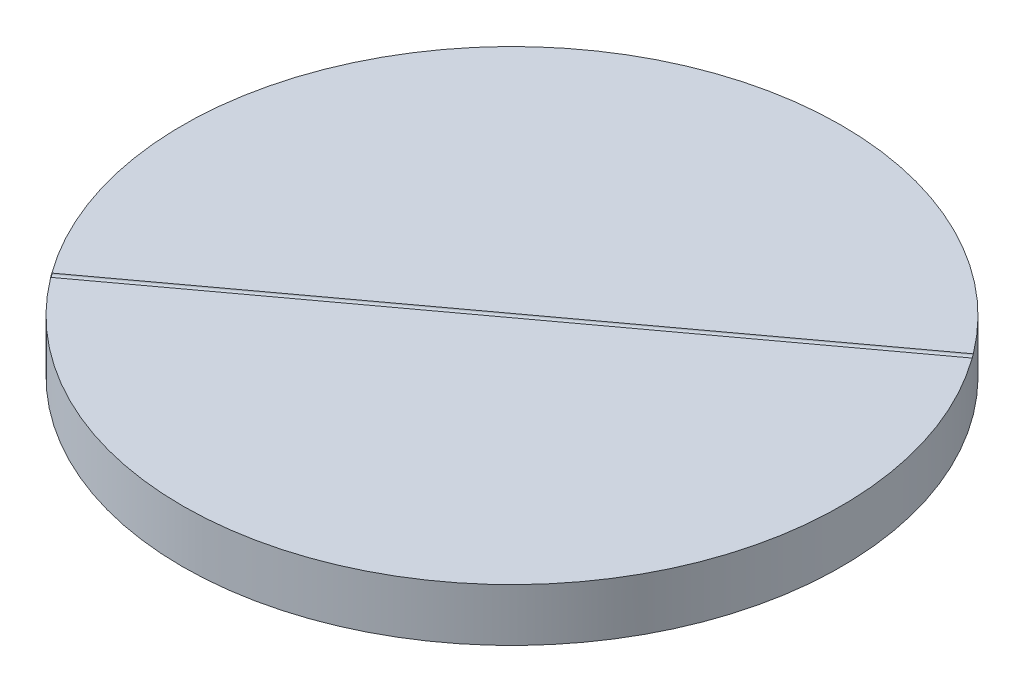
ISO-10303-21;
HEADER;
FILE_DESCRIPTION(('STEP AP214'),'2;1');
FILE_NAME('part.step','',(''),(''),'','','');
FILE_SCHEMA(('AUTOMOTIVE_DESIGN { 1 0 10303 214 1 1 1 1 }'));
ENDSEC;
DATA;
#1=APPLICATION_CONTEXT('core data for automotive mechanical design processes');
#2=APPLICATION_PROTOCOL_DEFINITION('international standard','automotive_design',2000,#1);
#3=PRODUCT_CONTEXT('',#1,'mechanical');
#4=PRODUCT('Part','Part','',(#3));
#5=PRODUCT_RELATED_PRODUCT_CATEGORY('part','',(#4));
#6=PRODUCT_DEFINITION_FORMATION('','',#4);
#7=PRODUCT_DEFINITION_CONTEXT('part definition',#1,'design');
#8=PRODUCT_DEFINITION('design','',#6,#7);
#9=PRODUCT_DEFINITION_SHAPE('','',#8);
#10=(LENGTH_UNIT() NAMED_UNIT(*) SI_UNIT(.MILLI.,.METRE.));
#11=(NAMED_UNIT(*) PLANE_ANGLE_UNIT() SI_UNIT($,.RADIAN.));
#12=(NAMED_UNIT(*) SI_UNIT($,.STERADIAN.) SOLID_ANGLE_UNIT());
#13=UNCERTAINTY_MEASURE_WITH_UNIT(LENGTH_MEASURE(1.E-05),#10,'distance_accuracy_value','');
#14=(GEOMETRIC_REPRESENTATION_CONTEXT(3) GLOBAL_UNCERTAINTY_ASSIGNED_CONTEXT((#13)) GLOBAL_UNIT_ASSIGNED_CONTEXT((#10,
#11,#12)) REPRESENTATION_CONTEXT('',''));
#15=CARTESIAN_POINT('',(0.,0.,0.));
#16=DIRECTION('',(0.,0.,1.));
#17=DIRECTION('',(1.,0.,0.));
#18=AXIS2_PLACEMENT_3D('',#15,#16,#17);
#19=CARTESIAN_POINT('',(0.,0.508,0.));
#20=DIRECTION('',(0.,1.,0.));
#21=DIRECTION('',(0.,0.,1.));
#22=AXIS2_PLACEMENT_3D('',#19,#20,#21);
#23=PLANE('',#22);
#24=DIRECTION('',(0.805193982699021,0.,-0.593011509353139));
#25=VECTOR('',#24,1.);
#26=CARTESIAN_POINT('',(-2.57147157838935,0.508,1.86229936410228));
#27=LINE('',#26,#25);
#28=CARTESIAN_POINT('',(-2.57147157838935,0.508,1.86229936410228));
#29=VERTEX_POINT('',#28);
#30=CARTESIAN_POINT('',(2.54134659371421,0.508,-1.90320321842339));
#31=VERTEX_POINT('',#30);
#32=EDGE_CURVE('E143',#29,#31,#27,.T.);
#33=ORIENTED_EDGE('',*,*,#32,.T.);
#34=CARTESIAN_POINT('',(0.,0.508,0.));
#35=DIRECTION('',(0.,1.,0.));
#36=DIRECTION('',(0.,0.,1.));
#37=AXIS2_PLACEMENT_3D('',#34,#35,#36);
#38=CIRCLE('',#37,3.175);
#39=EDGE_CURVE('E11',#31,#29,#38,.T.);
#40=ORIENTED_EDGE('',*,*,#39,.T.);
#41=EDGE_LOOP('',(#33,#40));
#42=FACE_BOUND('',#41,.T.);
#43=ADVANCED_FACE('F30',(#42),#23,.T.);
#44=CARTESIAN_POINT('',(0.,0.508,0.));
#45=DIRECTION('',(0.,-1.,0.));
#46=DIRECTION('',(0.,0.,-1.));
#47=AXIS2_PLACEMENT_3D('',#44,#45,#46);
#48=CYLINDRICAL_SURFACE('',#47,3.175);
#49=CARTESIAN_POINT('',(2.57147157838935,0.508,-1.86229936410228));
#50=DIRECTION('',(-0.5897859634685,0.,-0.807559606032603));
#51=VECTOR('',#50,1.);
#52=LINE('',#49,#51);
#53=CARTESIAN_POINT('',(2.57147157838935,0.508,-1.86229936410228));
#54=VERTEX_POINT('',#53);
#55=CARTESIAN_POINT('',(2.55649089506939,0.508,-1.88281154219622));
#56=VERTEX_POINT('',#55);
#57=EDGE_CURVE('E72',#54,#56,#52,.T.);
#58=ORIENTED_EDGE('',*,*,#57,.F.);
#59=CARTESIAN_POINT('',(-2.54134659371421,0.508,1.90320321842339));
#60=VERTEX_POINT('',#59);
#61=EDGE_CURVE('E41',#60,#54,#38,.T.);
#62=ORIENTED_EDGE('',*,*,#61,.F.);
#63=CARTESIAN_POINT('',(-2.55649089506939,0.508,1.88281154219622));
#64=DIRECTION('',(0.596227566863861,0.,0.802815476004044));
#65=VECTOR('',#64,1.);
#66=LINE('',#63,#65);
#67=CARTESIAN_POINT('',(-2.55649089506939,0.508,1.88281154219622));
#68=VERTEX_POINT('',#67);
#69=EDGE_CURVE('E49',#68,#60,#66,.T.);
#70=ORIENTED_EDGE('',*,*,#69,.F.);
#71=CARTESIAN_POINT('',(0.,0.508,0.));
#72=DIRECTION('',(0.,-1.,0.));
#73=DIRECTION('',(-0.805193982699018,0.,0.593011509353143));
#74=AXIS2_PLACEMENT_3D('',#71,#72,#73);
#75=CIRCLE('',#74,3.175);
#76=EDGE_CURVE('E54',#68,#29,#75,.T.);
#77=ORIENTED_EDGE('',*,*,#76,.T.);
#78=ORIENTED_EDGE('',*,*,#39,.F.);
#79=CARTESIAN_POINT('',(0.,0.508,0.));
#80=DIRECTION('',(0.,-1.,0.));
#81=DIRECTION('',(0.800424124004477,0.,-0.599434084542801));
#82=AXIS2_PLACEMENT_3D('',#79,#80,#81);
#83=CIRCLE('',#82,3.175);
#84=EDGE_CURVE('E75',#31,#56,#83,.T.);
#85=ORIENTED_EDGE('',*,*,#84,.T.);
#86=EDGE_LOOP('',(#58,#62,#70,#77,#78,#85));
#87=FACE_BOUND('',#86,.T.);
#88=CARTESIAN_POINT('',(0.,0.,0.));
#89=DIRECTION('',(0.,1.,0.));
#90=DIRECTION('',(0.,0.,1.));
#91=AXIS2_PLACEMENT_3D('',#88,#89,#90);
#92=CIRCLE('',#91,3.175);
#93=CARTESIAN_POINT('',(0.,0.,3.175));
#94=VERTEX_POINT('',#93);
#95=EDGE_CURVE('E80',#94,#94,#92,.T.);
#96=ORIENTED_EDGE('',*,*,#95,.T.);
#97=EDGE_LOOP('',(#96));
#98=FACE_BOUND('',#97,.T.);
#99=ADVANCED_FACE('F32',(#87,#98),#48,.T.);
#100=DIRECTION('',(0.805193982699021,0.,-0.593011509353139));
#101=VECTOR('',#100,1.);
#102=CARTESIAN_POINT('',(-2.54134659371421,0.508,1.90320321842339));
#103=LINE('',#102,#101);
#104=EDGE_CURVE('E84',#60,#54,#103,.T.);
#105=ORIENTED_EDGE('',*,*,#104,.F.);
#106=ORIENTED_EDGE('',*,*,#61,.T.);
#107=EDGE_LOOP('',(#105,#106));
#108=FACE_BOUND('',#107,.T.);
#109=ADVANCED_FACE('F90',(#108),#23,.T.);
#110=CARTESIAN_POINT('',(0.,0.,0.));
#111=DIRECTION('',(0.,1.,0.));
#112=DIRECTION('',(0.,0.,1.));
#113=AXIS2_PLACEMENT_3D('',#110,#111,#112);
#114=PLANE('',#113);
#115=ORIENTED_EDGE('',*,*,#95,.F.);
#116=EDGE_LOOP('',(#115));
#117=FACE_BOUND('',#116,.T.);
#118=ADVANCED_FACE('F117',(#117),#114,.F.);
#119=CARTESIAN_POINT('',(-2.55649089506939,0.508,1.88281154219622));
#120=DIRECTION('',(0.805193982699021,0.,-0.593011509353139));
#121=DIRECTION('',(-0.593011509353139,0.,-0.805193982699021));
#122=AXIS2_PLACEMENT_3D('',#119,#120,#121);
#123=CONICAL_SURFACE('',#122,0.,1.56679628412706);
#124=ORIENTED_EDGE('',*,*,#69,.T.);
#125=CARTESIAN_POINT('',(-2.55640908605178,0.508,1.88275129126284));
#126=DIRECTION('',(-0.805193982699021,0.,0.593011509353139));
#127=DIRECTION('',(0.593011509353139,0.,0.805193982699021));
#128=AXIS2_PLACEMENT_3D('',#125,#126,#127);
#129=CIRCLE('',#128,0.0253999999999996);
#130=EDGE_CURVE('E81',#29,#60,#129,.T.);
#131=ORIENTED_EDGE('',*,*,#130,.F.);
#132=ORIENTED_EDGE('',*,*,#76,.F.);
#133=EDGE_LOOP('',(#124,#131,#132));
#134=FACE_BOUND('',#133,.T.);
#135=ADVANCED_FACE('F119',(#134),#123,.F.);
#136=CARTESIAN_POINT('',(2.55640908605178,0.508,-1.88275129126284));
#137=DIRECTION('',(-0.805193982699021,0.,0.593011509353139));
#138=DIRECTION('',(0.593011509353139,0.,0.805193982699021));
#139=AXIS2_PLACEMENT_3D('',#136,#137,#138);
#140=CONICAL_SURFACE('',#139,0.0253999999999989,1.56679628412706);
#141=CARTESIAN_POINT('',(2.55640908605178,0.508,-1.88275129126284));
#142=DIRECTION('',(-0.805193982699021,0.,0.593011509353139));
#143=DIRECTION('',(0.593011509353139,0.,0.805193982699021));
#144=AXIS2_PLACEMENT_3D('',#141,#142,#143);
#145=CIRCLE('',#144,0.0253999999999992);
#146=EDGE_CURVE('E68',#31,#54,#145,.T.);
#147=ORIENTED_EDGE('',*,*,#146,.T.);
#148=ORIENTED_EDGE('',*,*,#57,.T.);
#149=ORIENTED_EDGE('',*,*,#84,.F.);
#150=EDGE_LOOP('',(#147,#148,#149));
#151=FACE_BOUND('',#150,.T.);
#152=ADVANCED_FACE('F70',(#151),#140,.F.);
#153=CARTESIAN_POINT('',(-2.55649089506939,0.508,1.88281154219622));
#154=DIRECTION('',(-0.805193982699021,0.,0.593011509353139));
#155=DIRECTION('',(0.593011509353139,0.,0.805193982699021));
#156=AXIS2_PLACEMENT_3D('',#153,#154,#155);
#157=CYLINDRICAL_SURFACE('',#156,0.0253999999999993);
#158=ORIENTED_EDGE('',*,*,#32,.F.);
#159=ORIENTED_EDGE('',*,*,#130,.T.);
#160=ORIENTED_EDGE('',*,*,#104,.T.);
#161=ORIENTED_EDGE('',*,*,#146,.F.);
#162=EDGE_LOOP('',(#158,#159,#160,#161));
#163=FACE_BOUND('',#162,.T.);
#164=ADVANCED_FACE('F86',(#163),#157,.F.);
#165=CLOSED_SHELL('',(#43,#99,#109,#118,#135,#152,#164));
#166=MANIFOLD_SOLID_BREP('B2',#165);
#167=ADVANCED_BREP_SHAPE_REPRESENTATION('',(#18,#166),#14);
#168=SHAPE_DEFINITION_REPRESENTATION(#9,#167);
ENDSEC;
END-ISO-10303-21;
